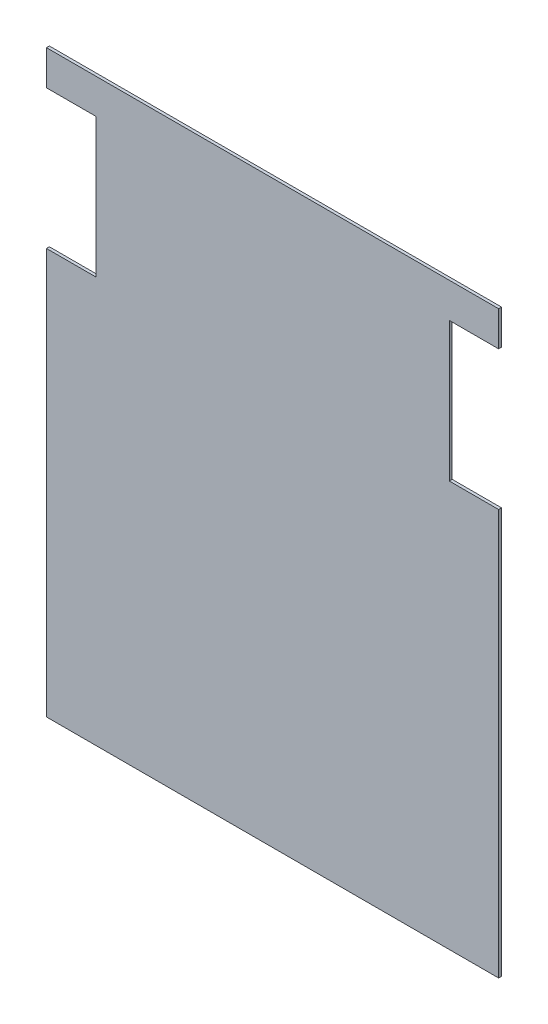
ISO-10303-21;
HEADER;
FILE_DESCRIPTION(('STEP AP214'),'2;1');
FILE_NAME('part.step','',(''),(''),'','','');
FILE_SCHEMA(('AUTOMOTIVE_DESIGN { 1 0 10303 214 1 1 1 1 }'));
ENDSEC;
DATA;
#1=APPLICATION_CONTEXT('core data for automotive mechanical design processes');
#2=APPLICATION_PROTOCOL_DEFINITION('international standard','automotive_design',2000,#1);
#3=PRODUCT_CONTEXT('',#1,'mechanical');
#4=PRODUCT('Part','Part','',(#3));
#5=PRODUCT_RELATED_PRODUCT_CATEGORY('part','',(#4));
#6=PRODUCT_DEFINITION_FORMATION('','',#4);
#7=PRODUCT_DEFINITION_CONTEXT('part definition',#1,'design');
#8=PRODUCT_DEFINITION('design','',#6,#7);
#9=PRODUCT_DEFINITION_SHAPE('','',#8);
#10=(LENGTH_UNIT() NAMED_UNIT(*) SI_UNIT(.MILLI.,.METRE.));
#11=(NAMED_UNIT(*) PLANE_ANGLE_UNIT() SI_UNIT($,.RADIAN.));
#12=(NAMED_UNIT(*) SI_UNIT($,.STERADIAN.) SOLID_ANGLE_UNIT());
#13=UNCERTAINTY_MEASURE_WITH_UNIT(LENGTH_MEASURE(1.E-05),#10,'distance_accuracy_value','');
#14=(GEOMETRIC_REPRESENTATION_CONTEXT(3) GLOBAL_UNCERTAINTY_ASSIGNED_CONTEXT((#13)) GLOBAL_UNIT_ASSIGNED_CONTEXT((#10,
#11,#12)) REPRESENTATION_CONTEXT('',''));
#15=CARTESIAN_POINT('',(0.,0.,0.));
#16=DIRECTION('',(0.,0.,1.));
#17=DIRECTION('',(1.,0.,0.));
#18=AXIS2_PLACEMENT_3D('',#15,#16,#17);
#19=CARTESIAN_POINT('',(-247.65,0.,3.175));
#20=DIRECTION('',(-1.,0.,0.));
#21=DIRECTION('',(0.,0.,1.));
#22=AXIS2_PLACEMENT_3D('',#19,#20,#21);
#23=PLANE('',#22);
#24=DIRECTION('',(0.,1.,0.));
#25=VECTOR('',#24,1.);
#26=CARTESIAN_POINT('',(-247.65,0.,0.));
#27=LINE('',#26,#25);
#28=CARTESIAN_POINT('',(-247.65,279.4,0.));
#29=VERTEX_POINT('',#28);
#30=CARTESIAN_POINT('',(-247.65,317.5,0.));
#31=VERTEX_POINT('',#30);
#32=EDGE_CURVE('E168',#29,#31,#27,.T.);
#33=ORIENTED_EDGE('',*,*,#32,.F.);
#34=DIRECTION('',(0.,0.,-1.));
#35=VECTOR('',#34,1.);
#36=CARTESIAN_POINT('',(-247.65,279.4,3.175));
#37=LINE('',#36,#35);
#38=CARTESIAN_POINT('',(-247.65,279.4,3.175));
#39=VERTEX_POINT('',#38);
#40=EDGE_CURVE('E11',#39,#29,#37,.T.);
#41=ORIENTED_EDGE('',*,*,#40,.F.);
#42=DIRECTION('',(0.,1.,0.));
#43=VECTOR('',#42,1.);
#44=CARTESIAN_POINT('',(-247.65,0.,3.175));
#45=LINE('',#44,#43);
#46=CARTESIAN_POINT('',(-247.65,317.5,3.175));
#47=VERTEX_POINT('',#46);
#48=EDGE_CURVE('E204',#39,#47,#45,.T.);
#49=ORIENTED_EDGE('',*,*,#48,.T.);
#50=DIRECTION('',(0.,0.,-1.));
#51=VECTOR('',#50,1.);
#52=CARTESIAN_POINT('',(-247.65,317.5,3.175));
#53=LINE('',#52,#51);
#54=EDGE_CURVE('E59',#47,#31,#53,.T.);
#55=ORIENTED_EDGE('',*,*,#54,.T.);
#56=EDGE_LOOP('',(#33,#41,#49,#55));
#57=FACE_BOUND('',#56,.T.);
#58=ADVANCED_FACE('F41',(#57),#23,.T.);
#59=CARTESIAN_POINT('',(0.,279.4,3.175));
#60=DIRECTION('',(0.,1.,0.));
#61=DIRECTION('',(0.,0.,1.));
#62=AXIS2_PLACEMENT_3D('',#59,#60,#61);
#63=PLANE('',#62);
#64=DIRECTION('',(1.,0.,0.));
#65=VECTOR('',#64,1.);
#66=CARTESIAN_POINT('',(0.,279.4,0.));
#67=LINE('',#66,#65);
#68=CARTESIAN_POINT('',(-193.675,279.4,0.));
#69=VERTEX_POINT('',#68);
#70=EDGE_CURVE('E171',#29,#69,#67,.T.);
#71=ORIENTED_EDGE('',*,*,#70,.T.);
#72=DIRECTION('',(0.,0.,-1.));
#73=VECTOR('',#72,1.);
#74=CARTESIAN_POINT('',(-193.675,279.4,3.175));
#75=LINE('',#74,#73);
#76=CARTESIAN_POINT('',(-193.675,279.4,3.175));
#77=VERTEX_POINT('',#76);
#78=EDGE_CURVE('E51',#77,#69,#75,.T.);
#79=ORIENTED_EDGE('',*,*,#78,.F.);
#80=DIRECTION('',(1.,0.,0.));
#81=VECTOR('',#80,1.);
#82=CARTESIAN_POINT('',(0.,279.4,3.175));
#83=LINE('',#82,#81);
#84=EDGE_CURVE('E261',#39,#77,#83,.T.);
#85=ORIENTED_EDGE('',*,*,#84,.F.);
#86=ORIENTED_EDGE('',*,*,#40,.T.);
#87=EDGE_LOOP('',(#71,#79,#85,#86));
#88=FACE_BOUND('',#87,.T.);
#89=ADVANCED_FACE('F43',(#88),#63,.F.);
#90=CARTESIAN_POINT('',(-193.675,0.,3.175));
#91=DIRECTION('',(1.,0.,0.));
#92=DIRECTION('',(0.,0.,-1.));
#93=AXIS2_PLACEMENT_3D('',#90,#91,#92);
#94=PLANE('',#93);
#95=DIRECTION('',(0.,-1.,0.));
#96=VECTOR('',#95,1.);
#97=CARTESIAN_POINT('',(-193.675,0.,0.));
#98=LINE('',#97,#96);
#99=CARTESIAN_POINT('',(-193.675,127.,0.));
#100=VERTEX_POINT('',#99);
#101=EDGE_CURVE('E175',#69,#100,#98,.T.);
#102=ORIENTED_EDGE('',*,*,#101,.T.);
#103=DIRECTION('',(0.,0.,-1.));
#104=VECTOR('',#103,1.);
#105=CARTESIAN_POINT('',(-193.675,127.,3.175));
#106=LINE('',#105,#104);
#107=CARTESIAN_POINT('',(-193.675,127.,3.175));
#108=VERTEX_POINT('',#107);
#109=EDGE_CURVE('E228',#108,#100,#106,.T.);
#110=ORIENTED_EDGE('',*,*,#109,.F.);
#111=DIRECTION('',(0.,-1.,0.));
#112=VECTOR('',#111,1.);
#113=CARTESIAN_POINT('',(-193.675,0.,3.175));
#114=LINE('',#113,#112);
#115=EDGE_CURVE('E238',#77,#108,#114,.T.);
#116=ORIENTED_EDGE('',*,*,#115,.F.);
#117=ORIENTED_EDGE('',*,*,#78,.T.);
#118=EDGE_LOOP('',(#102,#110,#116,#117));
#119=FACE_BOUND('',#118,.T.);
#120=ADVANCED_FACE('F236',(#119),#94,.F.);
#121=CARTESIAN_POINT('',(0.,127.,3.175));
#122=DIRECTION('',(0.,1.,0.));
#123=DIRECTION('',(0.,0.,1.));
#124=AXIS2_PLACEMENT_3D('',#121,#122,#123);
#125=PLANE('',#124);
#126=DIRECTION('',(1.,0.,0.));
#127=VECTOR('',#126,1.);
#128=CARTESIAN_POINT('',(0.,127.,0.));
#129=LINE('',#128,#127);
#130=CARTESIAN_POINT('',(-247.65,127.,0.));
#131=VERTEX_POINT('',#130);
#132=EDGE_CURVE('E179',#131,#100,#129,.T.);
#133=ORIENTED_EDGE('',*,*,#132,.F.);
#134=DIRECTION('',(0.,0.,-1.));
#135=VECTOR('',#134,1.);
#136=CARTESIAN_POINT('',(-247.65,127.,3.175));
#137=LINE('',#136,#135);
#138=CARTESIAN_POINT('',(-247.65,127.,3.175));
#139=VERTEX_POINT('',#138);
#140=EDGE_CURVE('E225',#139,#131,#137,.T.);
#141=ORIENTED_EDGE('',*,*,#140,.F.);
#142=DIRECTION('',(1.,0.,0.));
#143=VECTOR('',#142,1.);
#144=CARTESIAN_POINT('',(0.,127.,3.175));
#145=LINE('',#144,#143);
#146=EDGE_CURVE('E251',#139,#108,#145,.T.);
#147=ORIENTED_EDGE('',*,*,#146,.T.);
#148=ORIENTED_EDGE('',*,*,#109,.T.);
#149=EDGE_LOOP('',(#133,#141,#147,#148));
#150=FACE_BOUND('',#149,.T.);
#151=ADVANCED_FACE('F248',(#150),#125,.T.);
#152=CARTESIAN_POINT('',(-247.65,-317.5,0.));
#153=VERTEX_POINT('',#152);
#154=EDGE_CURVE('E172',#153,#131,#27,.T.);
#155=ORIENTED_EDGE('',*,*,#154,.F.);
#156=DIRECTION('',(0.,0.,-1.));
#157=VECTOR('',#156,1.);
#158=CARTESIAN_POINT('',(-247.65,-317.5,3.175));
#159=LINE('',#158,#157);
#160=CARTESIAN_POINT('',(-247.65,-317.5,3.175));
#161=VERTEX_POINT('',#160);
#162=EDGE_CURVE('E222',#161,#153,#159,.T.);
#163=ORIENTED_EDGE('',*,*,#162,.F.);
#164=EDGE_CURVE('E255',#161,#139,#45,.T.);
#165=ORIENTED_EDGE('',*,*,#164,.T.);
#166=ORIENTED_EDGE('',*,*,#140,.T.);
#167=EDGE_LOOP('',(#155,#163,#165,#166));
#168=FACE_BOUND('',#167,.T.);
#169=ADVANCED_FACE('F288',(#168),#23,.T.);
#170=CARTESIAN_POINT('',(0.,-317.5,3.175));
#171=DIRECTION('',(0.,1.,0.));
#172=DIRECTION('',(0.,0.,1.));
#173=AXIS2_PLACEMENT_3D('',#170,#171,#172);
#174=PLANE('',#173);
#175=DIRECTION('',(1.,0.,0.));
#176=VECTOR('',#175,1.);
#177=CARTESIAN_POINT('',(0.,-317.5,0.));
#178=LINE('',#177,#176);
#179=CARTESIAN_POINT('',(247.65,-317.5,0.));
#180=VERTEX_POINT('',#179);
#181=EDGE_CURVE('E183',#153,#180,#178,.T.);
#182=ORIENTED_EDGE('',*,*,#181,.T.);
#183=DIRECTION('',(0.,0.,-1.));
#184=VECTOR('',#183,1.);
#185=CARTESIAN_POINT('',(247.65,-317.5,3.175));
#186=LINE('',#185,#184);
#187=CARTESIAN_POINT('',(247.65,-317.5,3.175));
#188=VERTEX_POINT('',#187);
#189=EDGE_CURVE('E218',#188,#180,#186,.T.);
#190=ORIENTED_EDGE('',*,*,#189,.F.);
#191=DIRECTION('',(1.,0.,0.));
#192=VECTOR('',#191,1.);
#193=CARTESIAN_POINT('',(0.,-317.5,3.175));
#194=LINE('',#193,#192);
#195=EDGE_CURVE('E259',#161,#188,#194,.T.);
#196=ORIENTED_EDGE('',*,*,#195,.F.);
#197=ORIENTED_EDGE('',*,*,#162,.T.);
#198=EDGE_LOOP('',(#182,#190,#196,#197));
#199=FACE_BOUND('',#198,.T.);
#200=ADVANCED_FACE('F294',(#199),#174,.F.);
#201=CARTESIAN_POINT('',(247.65,0.,3.175));
#202=DIRECTION('',(-1.,0.,0.));
#203=DIRECTION('',(0.,0.,1.));
#204=AXIS2_PLACEMENT_3D('',#201,#202,#203);
#205=PLANE('',#204);
#206=DIRECTION('',(0.,1.,0.));
#207=VECTOR('',#206,1.);
#208=CARTESIAN_POINT('',(247.65,0.,0.));
#209=LINE('',#208,#207);
#210=CARTESIAN_POINT('',(247.65,127.,0.));
#211=VERTEX_POINT('',#210);
#212=EDGE_CURVE('E186',#180,#211,#209,.T.);
#213=ORIENTED_EDGE('',*,*,#212,.T.);
#214=DIRECTION('',(0.,0.,-1.));
#215=VECTOR('',#214,1.);
#216=CARTESIAN_POINT('',(247.65,127.,3.175));
#217=LINE('',#216,#215);
#218=CARTESIAN_POINT('',(247.65,127.,3.175));
#219=VERTEX_POINT('',#218);
#220=EDGE_CURVE('E214',#219,#211,#217,.T.);
#221=ORIENTED_EDGE('',*,*,#220,.F.);
#222=DIRECTION('',(0.,1.,0.));
#223=VECTOR('',#222,1.);
#224=CARTESIAN_POINT('',(247.65,0.,3.175));
#225=LINE('',#224,#223);
#226=EDGE_CURVE('E153',#188,#219,#225,.T.);
#227=ORIENTED_EDGE('',*,*,#226,.F.);
#228=ORIENTED_EDGE('',*,*,#189,.T.);
#229=EDGE_LOOP('',(#213,#221,#227,#228));
#230=FACE_BOUND('',#229,.T.);
#231=ADVANCED_FACE('F300',(#230),#205,.F.);
#232=CARTESIAN_POINT('',(0.,127.,3.175));
#233=DIRECTION('',(0.,-1.,0.));
#234=DIRECTION('',(0.,0.,-1.));
#235=AXIS2_PLACEMENT_3D('',#232,#233,#234);
#236=PLANE('',#235);
#237=DIRECTION('',(-1.,0.,0.));
#238=VECTOR('',#237,1.);
#239=CARTESIAN_POINT('',(0.,127.,0.));
#240=LINE('',#239,#238);
#241=CARTESIAN_POINT('',(193.675,127.,0.));
#242=VERTEX_POINT('',#241);
#243=EDGE_CURVE('E189',#211,#242,#240,.T.);
#244=ORIENTED_EDGE('',*,*,#243,.T.);
#245=DIRECTION('',(0.,0.,-1.));
#246=VECTOR('',#245,1.);
#247=CARTESIAN_POINT('',(193.675,127.,3.175));
#248=LINE('',#247,#246);
#249=CARTESIAN_POINT('',(193.675,127.,3.175));
#250=VERTEX_POINT('',#249);
#251=EDGE_CURVE('E211',#250,#242,#248,.T.);
#252=ORIENTED_EDGE('',*,*,#251,.F.);
#253=DIRECTION('',(-1.,0.,0.));
#254=VECTOR('',#253,1.);
#255=CARTESIAN_POINT('',(0.,127.,3.175));
#256=LINE('',#255,#254);
#257=EDGE_CURVE('E162',#219,#250,#256,.T.);
#258=ORIENTED_EDGE('',*,*,#257,.F.);
#259=ORIENTED_EDGE('',*,*,#220,.T.);
#260=EDGE_LOOP('',(#244,#252,#258,#259));
#261=FACE_BOUND('',#260,.T.);
#262=ADVANCED_FACE('F273',(#261),#236,.F.);
#263=CARTESIAN_POINT('',(193.675,0.,3.175));
#264=DIRECTION('',(1.,0.,0.));
#265=DIRECTION('',(0.,1.,0.));
#266=AXIS2_PLACEMENT_3D('',#263,#264,#265);
#267=PLANE('',#266);
#268=DIRECTION('',(0.,-1.,0.));
#269=VECTOR('',#268,1.);
#270=CARTESIAN_POINT('',(193.675,0.,0.));
#271=LINE('',#270,#269);
#272=CARTESIAN_POINT('',(193.675,279.4,0.));
#273=VERTEX_POINT('',#272);
#274=EDGE_CURVE('E194',#273,#242,#271,.T.);
#275=ORIENTED_EDGE('',*,*,#274,.F.);
#276=DIRECTION('',(0.,0.,-1.));
#277=VECTOR('',#276,1.);
#278=CARTESIAN_POINT('',(193.675,279.4,3.175));
#279=LINE('',#278,#277);
#280=CARTESIAN_POINT('',(193.675,279.4,3.175));
#281=VERTEX_POINT('',#280);
#282=EDGE_CURVE('E144',#281,#273,#279,.T.);
#283=ORIENTED_EDGE('',*,*,#282,.F.);
#284=DIRECTION('',(0.,-1.,0.));
#285=VECTOR('',#284,1.);
#286=CARTESIAN_POINT('',(193.675,0.,3.175));
#287=LINE('',#286,#285);
#288=EDGE_CURVE('E158',#281,#250,#287,.T.);
#289=ORIENTED_EDGE('',*,*,#288,.T.);
#290=ORIENTED_EDGE('',*,*,#251,.T.);
#291=EDGE_LOOP('',(#275,#283,#289,#290));
#292=FACE_BOUND('',#291,.T.);
#293=ADVANCED_FACE('F277',(#292),#267,.T.);
#294=CARTESIAN_POINT('',(0.,279.4,3.175));
#295=DIRECTION('',(0.,-1.,0.));
#296=DIRECTION('',(0.,0.,-1.));
#297=AXIS2_PLACEMENT_3D('',#294,#295,#296);
#298=PLANE('',#297);
#299=DIRECTION('',(-1.,0.,0.));
#300=VECTOR('',#299,1.);
#301=CARTESIAN_POINT('',(0.,279.4,0.));
#302=LINE('',#301,#300);
#303=CARTESIAN_POINT('',(247.65,279.4,0.));
#304=VERTEX_POINT('',#303);
#305=EDGE_CURVE('E140',#304,#273,#302,.T.);
#306=ORIENTED_EDGE('',*,*,#305,.F.);
#307=DIRECTION('',(0.,0.,-1.));
#308=VECTOR('',#307,1.);
#309=CARTESIAN_POINT('',(247.65,279.4,3.175));
#310=LINE('',#309,#308);
#311=CARTESIAN_POINT('',(247.65,279.4,3.175));
#312=VERTEX_POINT('',#311);
#313=EDGE_CURVE('E134',#312,#304,#310,.T.);
#314=ORIENTED_EDGE('',*,*,#313,.F.);
#315=DIRECTION('',(-1.,0.,0.));
#316=VECTOR('',#315,1.);
#317=CARTESIAN_POINT('',(0.,279.4,3.175));
#318=LINE('',#317,#316);
#319=EDGE_CURVE('E138',#312,#281,#318,.T.);
#320=ORIENTED_EDGE('',*,*,#319,.T.);
#321=ORIENTED_EDGE('',*,*,#282,.T.);
#322=EDGE_LOOP('',(#306,#314,#320,#321));
#323=FACE_BOUND('',#322,.T.);
#324=ADVANCED_FACE('F136',(#323),#298,.T.);
#325=CARTESIAN_POINT('',(247.65,317.5,0.));
#326=VERTEX_POINT('',#325);
#327=EDGE_CURVE('E190',#304,#326,#209,.T.);
#328=ORIENTED_EDGE('',*,*,#327,.T.);
#329=DIRECTION('',(0.,0.,-1.));
#330=VECTOR('',#329,1.);
#331=CARTESIAN_POINT('',(247.65,317.5,3.175));
#332=LINE('',#331,#330);
#333=CARTESIAN_POINT('',(247.65,317.5,3.175));
#334=VERTEX_POINT('',#333);
#335=EDGE_CURVE('E97',#334,#326,#332,.T.);
#336=ORIENTED_EDGE('',*,*,#335,.F.);
#337=EDGE_CURVE('E146',#312,#334,#225,.T.);
#338=ORIENTED_EDGE('',*,*,#337,.F.);
#339=ORIENTED_EDGE('',*,*,#313,.T.);
#340=EDGE_LOOP('',(#328,#336,#338,#339));
#341=FACE_BOUND('',#340,.T.);
#342=ADVANCED_FACE('F147',(#341),#205,.F.);
#343=CARTESIAN_POINT('',(0.,317.5,3.175));
#344=DIRECTION('',(0.,1.,0.));
#345=DIRECTION('',(0.,0.,1.));
#346=AXIS2_PLACEMENT_3D('',#343,#344,#345);
#347=PLANE('',#346);
#348=DIRECTION('',(1.,0.,0.));
#349=VECTOR('',#348,1.);
#350=CARTESIAN_POINT('',(0.,317.5,0.));
#351=LINE('',#350,#349);
#352=EDGE_CURVE('E200',#31,#326,#351,.T.);
#353=ORIENTED_EDGE('',*,*,#352,.F.);
#354=ORIENTED_EDGE('',*,*,#54,.F.);
#355=DIRECTION('',(1.,0.,0.));
#356=VECTOR('',#355,1.);
#357=CARTESIAN_POINT('',(0.,317.5,3.175));
#358=LINE('',#357,#356);
#359=EDGE_CURVE('E151',#47,#334,#358,.T.);
#360=ORIENTED_EDGE('',*,*,#359,.T.);
#361=ORIENTED_EDGE('',*,*,#335,.T.);
#362=EDGE_LOOP('',(#353,#354,#360,#361));
#363=FACE_BOUND('',#362,.T.);
#364=ADVANCED_FACE('F315',(#363),#347,.T.);
#365=CARTESIAN_POINT('',(0.,0.,3.175));
#366=DIRECTION('',(0.,0.,1.));
#367=DIRECTION('',(1.,0.,0.));
#368=AXIS2_PLACEMENT_3D('',#365,#366,#367);
#369=PLANE('',#368);
#370=ORIENTED_EDGE('',*,*,#48,.F.);
#371=ORIENTED_EDGE('',*,*,#84,.T.);
#372=ORIENTED_EDGE('',*,*,#115,.T.);
#373=ORIENTED_EDGE('',*,*,#146,.F.);
#374=ORIENTED_EDGE('',*,*,#164,.F.);
#375=ORIENTED_EDGE('',*,*,#195,.T.);
#376=ORIENTED_EDGE('',*,*,#226,.T.);
#377=ORIENTED_EDGE('',*,*,#257,.T.);
#378=ORIENTED_EDGE('',*,*,#288,.F.);
#379=ORIENTED_EDGE('',*,*,#319,.F.);
#380=ORIENTED_EDGE('',*,*,#337,.T.);
#381=ORIENTED_EDGE('',*,*,#359,.F.);
#382=EDGE_LOOP('',(#370,#371,#372,#373,#374,#375,#376,#377,#378,#379,#380,#381));
#383=FACE_BOUND('',#382,.T.);
#384=ADVANCED_FACE('F156',(#383),#369,.T.);
#385=CARTESIAN_POINT('',(0.,0.,0.));
#386=DIRECTION('',(0.,0.,1.));
#387=DIRECTION('',(1.,0.,0.));
#388=AXIS2_PLACEMENT_3D('',#385,#386,#387);
#389=PLANE('',#388);
#390=ORIENTED_EDGE('',*,*,#32,.T.);
#391=ORIENTED_EDGE('',*,*,#352,.T.);
#392=ORIENTED_EDGE('',*,*,#327,.F.);
#393=ORIENTED_EDGE('',*,*,#305,.T.);
#394=ORIENTED_EDGE('',*,*,#274,.T.);
#395=ORIENTED_EDGE('',*,*,#243,.F.);
#396=ORIENTED_EDGE('',*,*,#212,.F.);
#397=ORIENTED_EDGE('',*,*,#181,.F.);
#398=ORIENTED_EDGE('',*,*,#154,.T.);
#399=ORIENTED_EDGE('',*,*,#132,.T.);
#400=ORIENTED_EDGE('',*,*,#101,.F.);
#401=ORIENTED_EDGE('',*,*,#70,.F.);
#402=EDGE_LOOP('',(#390,#391,#392,#393,#394,#395,#396,#397,#398,#399,#400,#401));
#403=FACE_BOUND('',#402,.T.);
#404=ADVANCED_FACE('F242',(#403),#389,.F.);
#405=CLOSED_SHELL('',(#58,#89,#120,#151,#169,#200,#231,#262,#293,#324,#342,#364,#384,#404));
#406=MANIFOLD_SOLID_BREP('B2',#405);
#407=ADVANCED_BREP_SHAPE_REPRESENTATION('',(#18,#406),#14);
#408=SHAPE_DEFINITION_REPRESENTATION(#9,#407);
ENDSEC;
END-ISO-10303-21;
